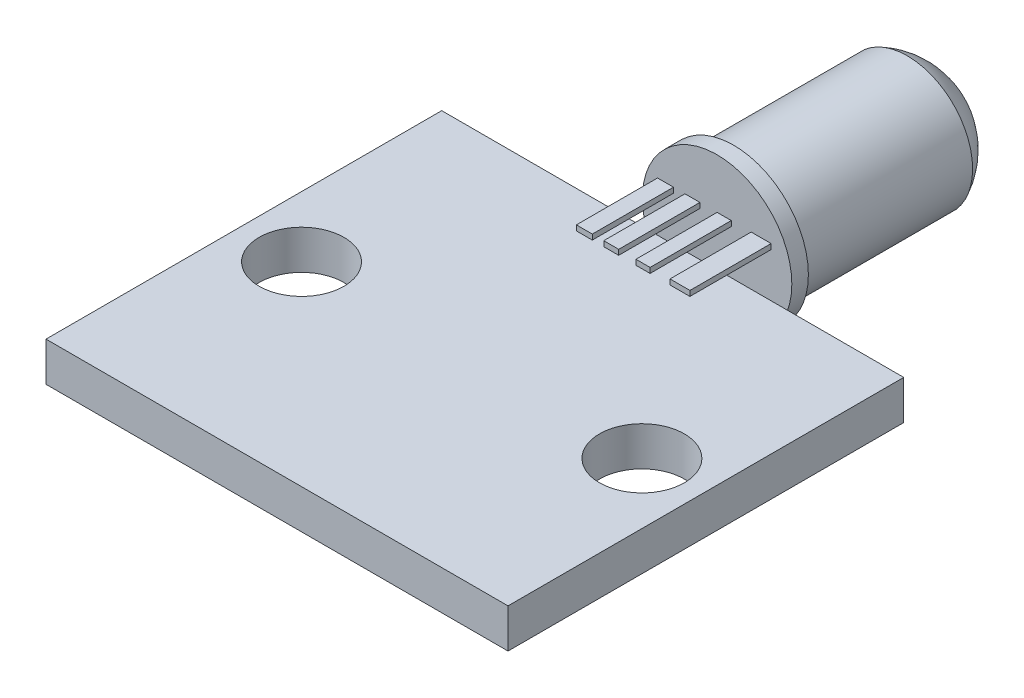
ISO-10303-21;
HEADER;
FILE_DESCRIPTION(('STEP AP214'),'2;1');
FILE_NAME('part.step','',(''),(''),'','','');
FILE_SCHEMA(('AUTOMOTIVE_DESIGN { 1 0 10303 214 1 1 1 1 }'));
ENDSEC;
DATA;
#1=APPLICATION_CONTEXT('core data for automotive mechanical design processes');
#2=APPLICATION_PROTOCOL_DEFINITION('international standard','automotive_design',2000,#1);
#3=PRODUCT_CONTEXT('',#1,'mechanical');
#4=PRODUCT('Part','Part','',(#3));
#5=PRODUCT_RELATED_PRODUCT_CATEGORY('part','',(#4));
#6=PRODUCT_DEFINITION_FORMATION('','',#4);
#7=PRODUCT_DEFINITION_CONTEXT('part definition',#1,'design');
#8=PRODUCT_DEFINITION('design','',#6,#7);
#9=PRODUCT_DEFINITION_SHAPE('','',#8);
#10=(LENGTH_UNIT() NAMED_UNIT(*) SI_UNIT(.MILLI.,.METRE.));
#11=(NAMED_UNIT(*) PLANE_ANGLE_UNIT() SI_UNIT($,.RADIAN.));
#12=(NAMED_UNIT(*) SI_UNIT($,.STERADIAN.) SOLID_ANGLE_UNIT());
#13=UNCERTAINTY_MEASURE_WITH_UNIT(LENGTH_MEASURE(1.E-05),#10,'distance_accuracy_value','');
#14=(GEOMETRIC_REPRESENTATION_CONTEXT(3) GLOBAL_UNCERTAINTY_ASSIGNED_CONTEXT((#13)) GLOBAL_UNIT_ASSIGNED_CONTEXT((#10,
#11,#12)) REPRESENTATION_CONTEXT('',''));
#15=CARTESIAN_POINT('',(0.,0.,0.));
#16=DIRECTION('',(0.,0.,1.));
#17=DIRECTION('',(1.,0.,0.));
#18=AXIS2_PLACEMENT_3D('',#15,#16,#17);
#19=CARTESIAN_POINT('',(0.,0.75,0.));
#20=DIRECTION('',(0.,-1.,0.));
#21=DIRECTION('',(0.,0.,-1.));
#22=AXIS2_PLACEMENT_3D('',#19,#20,#21);
#23=PLANE('',#22);
#24=CARTESIAN_POINT('',(-6.52,0.75,0.120000000000001));
#25=DIRECTION('',(0.,1.,0.));
#26=DIRECTION('',(0.,0.,1.));
#27=AXIS2_PLACEMENT_3D('',#24,#25,#26);
#28=CIRCLE('',#27,1.625);
#29=CARTESIAN_POINT('',(-6.52,0.75,1.745));
#30=VERTEX_POINT('',#29);
#31=EDGE_CURVE('E355',#30,#30,#28,.T.);
#32=ORIENTED_EDGE('',*,*,#31,.F.);
#33=EDGE_LOOP('',(#32));
#34=FACE_BOUND('',#33,.T.);
#35=CARTESIAN_POINT('',(6.52,0.75,0.120000000000001));
#36=DIRECTION('',(0.,1.,0.));
#37=DIRECTION('',(0.,0.,1.));
#38=AXIS2_PLACEMENT_3D('',#35,#36,#37);
#39=CIRCLE('',#38,1.625);
#40=CARTESIAN_POINT('',(6.52,0.75,1.745));
#41=VERTEX_POINT('',#40);
#42=EDGE_CURVE('E349',#41,#41,#39,.T.);
#43=ORIENTED_EDGE('',*,*,#42,.F.);
#44=EDGE_LOOP('',(#43));
#45=FACE_BOUND('',#44,.T.);
#46=DIRECTION('',(0.,0.,1.));
#47=VECTOR('',#46,1.);
#48=CARTESIAN_POINT('',(1.30594712778117,0.75,-9.28));
#49=LINE('',#48,#47);
#50=CARTESIAN_POINT('',(1.30594712778117,0.75,-7.58));
#51=VERTEX_POINT('',#50);
#52=CARTESIAN_POINT('',(1.30594712778117,0.75,-6.16953824510332));
#53=VERTEX_POINT('',#52);
#54=EDGE_CURVE('E219',#51,#53,#49,.T.);
#55=ORIENTED_EDGE('',*,*,#54,.F.);
#56=DIRECTION('',(-1.,0.,0.));
#57=VECTOR('',#56,1.);
#58=CARTESIAN_POINT('',(8.85,0.75,-7.58));
#59=LINE('',#58,#57);
#60=CARTESIAN_POINT('',(0.542718383648274,0.75,-7.58));
#61=VERTEX_POINT('',#60);
#62=EDGE_CURVE('E373',#51,#61,#59,.T.);
#63=ORIENTED_EDGE('',*,*,#62,.T.);
#64=DIRECTION('',(0.,0.,-1.));
#65=VECTOR('',#64,1.);
#66=CARTESIAN_POINT('',(0.542718383648274,0.75,-9.28));
#67=LINE('',#66,#65);
#68=CARTESIAN_POINT('',(0.542718383648274,0.75,-6.16953824510332));
#69=VERTEX_POINT('',#68);
#70=EDGE_CURVE('E249',#69,#61,#67,.T.);
#71=ORIENTED_EDGE('',*,*,#70,.F.);
#72=DIRECTION('',(1.,0.,0.));
#73=VECTOR('',#72,1.);
#74=CARTESIAN_POINT('',(0.,0.75,-6.16953824510332));
#75=LINE('',#74,#73);
#76=CARTESIAN_POINT('',(0.,0.75,-6.16953824510332));
#77=VERTEX_POINT('',#76);
#78=EDGE_CURVE('E245',#77,#69,#75,.T.);
#79=ORIENTED_EDGE('',*,*,#78,.F.);
#80=DIRECTION('',(0.,0.,1.));
#81=VECTOR('',#80,1.);
#82=CARTESIAN_POINT('',(0.,0.75,-9.28));
#83=LINE('',#82,#81);
#84=CARTESIAN_POINT('',(0.,0.75,-7.58));
#85=VERTEX_POINT('',#84);
#86=EDGE_CURVE('E223',#85,#77,#83,.T.);
#87=ORIENTED_EDGE('',*,*,#86,.F.);
#88=CARTESIAN_POINT('',(-0.659366888361046,0.75,-7.58));
#89=VERTEX_POINT('',#88);
#90=EDGE_CURVE('E464',#85,#89,#59,.T.);
#91=ORIENTED_EDGE('',*,*,#90,.T.);
#92=DIRECTION('',(0.,0.,-1.));
#93=VECTOR('',#92,1.);
#94=CARTESIAN_POINT('',(-0.659366888361046,0.75,-9.28));
#95=LINE('',#94,#93);
#96=CARTESIAN_POINT('',(-0.659366888361046,0.75,-6.16953824510332));
#97=VERTEX_POINT('',#96);
#98=EDGE_CURVE('E287',#97,#89,#95,.T.);
#99=ORIENTED_EDGE('',*,*,#98,.F.);
#100=DIRECTION('',(1.,0.,0.));
#101=VECTOR('',#100,1.);
#102=CARTESIAN_POINT('',(-1.23178844646072,0.75,-6.16953824510332));
#103=LINE('',#102,#101);
#104=CARTESIAN_POINT('',(-1.23178844646072,0.75,-6.16953824510332));
#105=VERTEX_POINT('',#104);
#106=EDGE_CURVE('E283',#105,#97,#103,.T.);
#107=ORIENTED_EDGE('',*,*,#106,.F.);
#108=DIRECTION('',(0.,0.,1.));
#109=VECTOR('',#108,1.);
#110=CARTESIAN_POINT('',(-1.23178844646072,0.75,-9.28));
#111=LINE('',#110,#109);
#112=CARTESIAN_POINT('',(-1.23178844646072,0.75,-7.58));
#113=VERTEX_POINT('',#112);
#114=EDGE_CURVE('E266',#113,#105,#111,.T.);
#115=ORIENTED_EDGE('',*,*,#114,.F.);
#116=CARTESIAN_POINT('',(-1.67064497433714,0.75,-7.58));
#117=VERTEX_POINT('',#116);
#118=EDGE_CURVE('E461',#113,#117,#59,.T.);
#119=ORIENTED_EDGE('',*,*,#118,.T.);
#120=DIRECTION('',(0.,0.,-1.));
#121=VECTOR('',#120,1.);
#122=CARTESIAN_POINT('',(-1.67064497433714,0.75,-9.28));
#123=LINE('',#122,#121);
#124=CARTESIAN_POINT('',(-1.67064497433714,0.75,-6.16953824510332));
#125=VERTEX_POINT('',#124);
#126=EDGE_CURVE('E334',#125,#117,#123,.T.);
#127=ORIENTED_EDGE('',*,*,#126,.F.);
#128=DIRECTION('',(1.,0.,0.));
#129=VECTOR('',#128,1.);
#130=CARTESIAN_POINT('',(-2.28122796964346,0.75,-6.16953824510332));
#131=LINE('',#130,#129);
#132=CARTESIAN_POINT('',(-2.28122796964346,0.75,-6.16953824510332));
#133=VERTEX_POINT('',#132);
#134=EDGE_CURVE('E330',#133,#125,#131,.T.);
#135=ORIENTED_EDGE('',*,*,#134,.F.);
#136=DIRECTION('',(0.,0.,1.));
#137=VECTOR('',#136,1.);
#138=CARTESIAN_POINT('',(-2.28122796964346,0.75,-9.28));
#139=LINE('',#138,#137);
#140=CARTESIAN_POINT('',(-2.28122796964346,0.75,-7.58));
#141=VERTEX_POINT('',#140);
#142=EDGE_CURVE('E11',#141,#133,#139,.T.);
#143=ORIENTED_EDGE('',*,*,#142,.F.);
#144=CARTESIAN_POINT('',(-8.85,0.75,-7.58));
#145=VERTEX_POINT('',#144);
#146=EDGE_CURVE('E369',#141,#145,#59,.T.);
#147=ORIENTED_EDGE('',*,*,#146,.T.);
#148=DIRECTION('',(0.,0.,1.));
#149=VECTOR('',#148,1.);
#150=CARTESIAN_POINT('',(-8.85,0.75,-7.58));
#151=LINE('',#150,#149);
#152=CARTESIAN_POINT('',(-8.85,0.75,7.58));
#153=VERTEX_POINT('',#152);
#154=EDGE_CURVE('E361',#145,#153,#151,.T.);
#155=ORIENTED_EDGE('',*,*,#154,.T.);
#156=DIRECTION('',(1.,0.,0.));
#157=VECTOR('',#156,1.);
#158=CARTESIAN_POINT('',(8.85,0.75,7.58));
#159=LINE('',#158,#157);
#160=CARTESIAN_POINT('',(8.85,0.75,7.58));
#161=VERTEX_POINT('',#160);
#162=EDGE_CURVE('E364',#153,#161,#159,.T.);
#163=ORIENTED_EDGE('',*,*,#162,.T.);
#164=DIRECTION('',(0.,0.,-1.));
#165=VECTOR('',#164,1.);
#166=CARTESIAN_POINT('',(8.85,0.75,-7.58));
#167=LINE('',#166,#165);
#168=CARTESIAN_POINT('',(8.85,0.75,-7.58));
#169=VERTEX_POINT('',#168);
#170=EDGE_CURVE('E367',#161,#169,#167,.T.);
#171=ORIENTED_EDGE('',*,*,#170,.T.);
#172=CARTESIAN_POINT('',(2.06917587191407,0.75,-7.58));
#173=VERTEX_POINT('',#172);
#174=EDGE_CURVE('E370',#169,#173,#59,.T.);
#175=ORIENTED_EDGE('',*,*,#174,.T.);
#176=DIRECTION('',(0.,0.,-1.));
#177=VECTOR('',#176,1.);
#178=CARTESIAN_POINT('',(2.06917587191407,0.75,-9.28));
#179=LINE('',#178,#177);
#180=CARTESIAN_POINT('',(2.06917587191407,0.75,-6.16953824510332));
#181=VERTEX_POINT('',#180);
#182=EDGE_CURVE('E55',#181,#173,#179,.T.);
#183=ORIENTED_EDGE('',*,*,#182,.F.);
#184=DIRECTION('',(1.,0.,0.));
#185=VECTOR('',#184,1.);
#186=CARTESIAN_POINT('',(1.30594712778117,0.75,-6.16953824510332));
#187=LINE('',#186,#185);
#188=EDGE_CURVE('E50',#53,#181,#187,.T.);
#189=ORIENTED_EDGE('',*,*,#188,.F.);
#190=EDGE_LOOP('',(#55,#63,#71,#79,#87,#91,#99,#107,#115,#119,#127,#135,#143,#147,#155,#163,
#171,#175,#183,#189));
#191=FACE_BOUND('',#190,.T.);
#192=ADVANCED_FACE('F33',(#34,#45,#191),#23,.F.);
#193=CARTESIAN_POINT('',(0.,-0.75,0.));
#194=DIRECTION('',(0.,-1.,0.));
#195=DIRECTION('',(0.,0.,-1.));
#196=AXIS2_PLACEMENT_3D('',#193,#194,#195);
#197=PLANE('',#196);
#198=CARTESIAN_POINT('',(-6.52,-0.75,0.120000000000001));
#199=DIRECTION('',(0.,1.,0.));
#200=DIRECTION('',(0.,0.,1.));
#201=AXIS2_PLACEMENT_3D('',#198,#199,#200);
#202=CIRCLE('',#201,1.625);
#203=CARTESIAN_POINT('',(-6.52,-0.75,1.745));
#204=VERTEX_POINT('',#203);
#205=EDGE_CURVE('E352',#204,#204,#202,.T.);
#206=ORIENTED_EDGE('',*,*,#205,.T.);
#207=EDGE_LOOP('',(#206));
#208=FACE_BOUND('',#207,.T.);
#209=DIRECTION('',(0.,0.,1.));
#210=VECTOR('',#209,1.);
#211=CARTESIAN_POINT('',(-8.85,-0.75,-7.58));
#212=LINE('',#211,#210);
#213=CARTESIAN_POINT('',(-8.85,-0.75,-7.58));
#214=VERTEX_POINT('',#213);
#215=CARTESIAN_POINT('',(-8.85,-0.75,7.58));
#216=VERTEX_POINT('',#215);
#217=EDGE_CURVE('E358',#214,#216,#212,.T.);
#218=ORIENTED_EDGE('',*,*,#217,.F.);
#219=DIRECTION('',(-1.,0.,0.));
#220=VECTOR('',#219,1.);
#221=CARTESIAN_POINT('',(8.85,-0.75,-7.58));
#222=LINE('',#221,#220);
#223=CARTESIAN_POINT('',(8.85,-0.75,-7.58));
#224=VERTEX_POINT('',#223);
#225=EDGE_CURVE('E365',#224,#214,#222,.T.);
#226=ORIENTED_EDGE('',*,*,#225,.F.);
#227=DIRECTION('',(0.,0.,-1.));
#228=VECTOR('',#227,1.);
#229=CARTESIAN_POINT('',(8.85,-0.75,-7.58));
#230=LINE('',#229,#228);
#231=CARTESIAN_POINT('',(8.85,-0.75,7.58));
#232=VERTEX_POINT('',#231);
#233=EDGE_CURVE('E379',#232,#224,#230,.T.);
#234=ORIENTED_EDGE('',*,*,#233,.F.);
#235=DIRECTION('',(1.,0.,0.));
#236=VECTOR('',#235,1.);
#237=CARTESIAN_POINT('',(8.85,-0.75,7.58));
#238=LINE('',#237,#236);
#239=EDGE_CURVE('E377',#216,#232,#238,.T.);
#240=ORIENTED_EDGE('',*,*,#239,.F.);
#241=EDGE_LOOP('',(#218,#226,#234,#240));
#242=FACE_BOUND('',#241,.T.);
#243=CARTESIAN_POINT('',(6.52,-0.75,0.120000000000001));
#244=DIRECTION('',(0.,1.,0.));
#245=DIRECTION('',(0.,0.,1.));
#246=AXIS2_PLACEMENT_3D('',#243,#244,#245);
#247=CIRCLE('',#246,1.625);
#248=CARTESIAN_POINT('',(6.52,-0.75,1.745));
#249=VERTEX_POINT('',#248);
#250=EDGE_CURVE('E348',#249,#249,#247,.T.);
#251=ORIENTED_EDGE('',*,*,#250,.T.);
#252=EDGE_LOOP('',(#251));
#253=FACE_BOUND('',#252,.T.);
#254=ADVANCED_FACE('F402',(#208,#242,#253),#197,.T.);
#255=CARTESIAN_POINT('',(-8.85,0.75,-7.58));
#256=DIRECTION('',(1.,0.,0.));
#257=DIRECTION('',(0.,0.,-1.));
#258=AXIS2_PLACEMENT_3D('',#255,#256,#257);
#259=PLANE('',#258);
#260=ORIENTED_EDGE('',*,*,#217,.T.);
#261=DIRECTION('',(0.,-1.,0.));
#262=VECTOR('',#261,1.);
#263=CARTESIAN_POINT('',(-8.85,0.75,7.58));
#264=LINE('',#263,#262);
#265=EDGE_CURVE('E37',#153,#216,#264,.T.);
#266=ORIENTED_EDGE('',*,*,#265,.F.);
#267=ORIENTED_EDGE('',*,*,#154,.F.);
#268=DIRECTION('',(0.,-1.,0.));
#269=VECTOR('',#268,1.);
#270=CARTESIAN_POINT('',(-8.85,0.75,-7.58));
#271=LINE('',#270,#269);
#272=EDGE_CURVE('E372',#145,#214,#271,.T.);
#273=ORIENTED_EDGE('',*,*,#272,.T.);
#274=EDGE_LOOP('',(#260,#266,#267,#273));
#275=FACE_BOUND('',#274,.T.);
#276=ADVANCED_FACE('F35',(#275),#259,.F.);
#277=CARTESIAN_POINT('',(8.85,0.75,7.58));
#278=DIRECTION('',(0.,0.,-1.));
#279=DIRECTION('',(-1.,0.,0.));
#280=AXIS2_PLACEMENT_3D('',#277,#278,#279);
#281=PLANE('',#280);
#282=ORIENTED_EDGE('',*,*,#239,.T.);
#283=DIRECTION('',(0.,-1.,0.));
#284=VECTOR('',#283,1.);
#285=CARTESIAN_POINT('',(8.85,0.75,7.58));
#286=LINE('',#285,#284);
#287=EDGE_CURVE('E386',#161,#232,#286,.T.);
#288=ORIENTED_EDGE('',*,*,#287,.F.);
#289=ORIENTED_EDGE('',*,*,#162,.F.);
#290=ORIENTED_EDGE('',*,*,#265,.T.);
#291=EDGE_LOOP('',(#282,#288,#289,#290));
#292=FACE_BOUND('',#291,.T.);
#293=ADVANCED_FACE('F395',(#292),#281,.F.);
#294=CARTESIAN_POINT('',(8.85,0.75,-7.58));
#295=DIRECTION('',(-1.,0.,0.));
#296=DIRECTION('',(0.,0.,1.));
#297=AXIS2_PLACEMENT_3D('',#294,#295,#296);
#298=PLANE('',#297);
#299=ORIENTED_EDGE('',*,*,#233,.T.);
#300=DIRECTION('',(0.,-1.,0.));
#301=VECTOR('',#300,1.);
#302=CARTESIAN_POINT('',(8.85,0.75,-7.58));
#303=LINE('',#302,#301);
#304=EDGE_CURVE('E384',#169,#224,#303,.T.);
#305=ORIENTED_EDGE('',*,*,#304,.F.);
#306=ORIENTED_EDGE('',*,*,#170,.F.);
#307=ORIENTED_EDGE('',*,*,#287,.T.);
#308=EDGE_LOOP('',(#299,#305,#306,#307));
#309=FACE_BOUND('',#308,.T.);
#310=ADVANCED_FACE('F405',(#309),#298,.F.);
#311=CARTESIAN_POINT('',(8.85,0.75,-7.58));
#312=DIRECTION('',(0.,0.,1.));
#313=DIRECTION('',(1.,0.,0.));
#314=AXIS2_PLACEMENT_3D('',#311,#312,#313);
#315=PLANE('',#314);
#316=ORIENTED_EDGE('',*,*,#225,.T.);
#317=ORIENTED_EDGE('',*,*,#272,.F.);
#318=ORIENTED_EDGE('',*,*,#146,.F.);
#319=EDGE_CURVE('E374',#117,#141,#59,.T.);
#320=ORIENTED_EDGE('',*,*,#319,.F.);
#321=ORIENTED_EDGE('',*,*,#118,.F.);
#322=DIRECTION('',(-1.,0.,0.));
#323=VECTOR('',#322,1.);
#324=CARTESIAN_POINT('',(8.85,0.75,-7.58));
#325=LINE('',#324,#323);
#326=EDGE_CURVE('E301',#89,#113,#325,.T.);
#327=ORIENTED_EDGE('',*,*,#326,.F.);
#328=ORIENTED_EDGE('',*,*,#90,.F.);
#329=DIRECTION('',(-1.,0.,0.));
#330=VECTOR('',#329,1.);
#331=CARTESIAN_POINT('',(8.85,0.75,-7.58));
#332=LINE('',#331,#330);
#333=EDGE_CURVE('E263',#61,#85,#332,.T.);
#334=ORIENTED_EDGE('',*,*,#333,.F.);
#335=ORIENTED_EDGE('',*,*,#62,.F.);
#336=DIRECTION('',(-1.,0.,0.));
#337=VECTOR('',#336,1.);
#338=CARTESIAN_POINT('',(8.85,0.75,-7.58));
#339=LINE('',#338,#337);
#340=EDGE_CURVE('E220',#173,#51,#339,.T.);
#341=ORIENTED_EDGE('',*,*,#340,.F.);
#342=ORIENTED_EDGE('',*,*,#174,.F.);
#343=ORIENTED_EDGE('',*,*,#304,.T.);
#344=EDGE_LOOP('',(#316,#317,#318,#320,#321,#327,#328,#334,#335,#341,#342,#343));
#345=FACE_BOUND('',#344,.T.);
#346=ADVANCED_FACE('F408',(#345),#315,.F.);
#347=CARTESIAN_POINT('',(-6.52,0.75,0.120000000000001));
#348=DIRECTION('',(0.,-1.,0.));
#349=DIRECTION('',(0.,0.,-1.));
#350=AXIS2_PLACEMENT_3D('',#347,#348,#349);
#351=CYLINDRICAL_SURFACE('',#350,1.625);
#352=ORIENTED_EDGE('',*,*,#31,.T.);
#353=EDGE_LOOP('',(#352));
#354=FACE_BOUND('',#353,.T.);
#355=ORIENTED_EDGE('',*,*,#205,.F.);
#356=EDGE_LOOP('',(#355));
#357=FACE_BOUND('',#356,.T.);
#358=ADVANCED_FACE('F508',(#354,#357),#351,.F.);
#359=CARTESIAN_POINT('',(6.52,0.75,0.120000000000001));
#360=DIRECTION('',(0.,-1.,0.));
#361=DIRECTION('',(0.,0.,-1.));
#362=AXIS2_PLACEMENT_3D('',#359,#360,#361);
#363=CYLINDRICAL_SURFACE('',#362,1.625);
#364=ORIENTED_EDGE('',*,*,#42,.T.);
#365=EDGE_LOOP('',(#364));
#366=FACE_BOUND('',#365,.T.);
#367=ORIENTED_EDGE('',*,*,#250,.F.);
#368=EDGE_LOOP('',(#367));
#369=FACE_BOUND('',#368,.T.);
#370=ADVANCED_FACE('F551',(#366,#369),#363,.F.);
#371=CARTESIAN_POINT('',(0.,0.75,0.));
#372=DIRECTION('',(0.,1.,0.));
#373=DIRECTION('',(0.,0.,1.));
#374=AXIS2_PLACEMENT_3D('',#371,#372,#373);
#375=PLANE('',#374);
#376=CARTESIAN_POINT('',(-1.67064497433714,0.75,-9.28));
#377=VERTEX_POINT('',#376);
#378=EDGE_CURVE('E333',#117,#377,#123,.T.);
#379=ORIENTED_EDGE('',*,*,#378,.F.);
#380=ORIENTED_EDGE('',*,*,#319,.T.);
#381=CARTESIAN_POINT('',(-2.28122796964346,0.75,-9.28));
#382=VERTEX_POINT('',#381);
#383=EDGE_CURVE('E43',#382,#141,#139,.T.);
#384=ORIENTED_EDGE('',*,*,#383,.F.);
#385=DIRECTION('',(-1.,0.,0.));
#386=VECTOR('',#385,1.);
#387=CARTESIAN_POINT('',(-2.28122796964346,0.75,-9.28));
#388=LINE('',#387,#386);
#389=EDGE_CURVE('E320',#377,#382,#388,.T.);
#390=ORIENTED_EDGE('',*,*,#389,.F.);
#391=EDGE_LOOP('',(#379,#380,#384,#390));
#392=FACE_BOUND('',#391,.T.);
#393=ADVANCED_FACE('F449',(#392),#375,.F.);
#394=CARTESIAN_POINT('',(-2.28122796964346,0.95,-9.28));
#395=DIRECTION('',(1.,0.,0.));
#396=DIRECTION('',(0.,0.,-1.));
#397=AXIS2_PLACEMENT_3D('',#394,#395,#396);
#398=PLANE('',#397);
#399=ORIENTED_EDGE('',*,*,#383,.T.);
#400=ORIENTED_EDGE('',*,*,#142,.T.);
#401=DIRECTION('',(0.,-1.,0.));
#402=VECTOR('',#401,1.);
#403=CARTESIAN_POINT('',(-2.28122796964346,0.95,-6.16953824510332));
#404=LINE('',#403,#402);
#405=CARTESIAN_POINT('',(-2.28122796964346,0.95,-6.16953824510332));
#406=VERTEX_POINT('',#405);
#407=EDGE_CURVE('E345',#406,#133,#404,.T.);
#408=ORIENTED_EDGE('',*,*,#407,.F.);
#409=DIRECTION('',(0.,0.,1.));
#410=VECTOR('',#409,1.);
#411=CARTESIAN_POINT('',(-2.28122796964346,0.95,-9.28));
#412=LINE('',#411,#410);
#413=CARTESIAN_POINT('',(-2.28122796964346,0.95,-9.28));
#414=VERTEX_POINT('',#413);
#415=EDGE_CURVE('E316',#414,#406,#412,.T.);
#416=ORIENTED_EDGE('',*,*,#415,.F.);
#417=DIRECTION('',(0.,-1.,0.));
#418=VECTOR('',#417,1.);
#419=CARTESIAN_POINT('',(-2.28122796964346,0.95,-9.28));
#420=LINE('',#419,#418);
#421=EDGE_CURVE('E327',#414,#382,#420,.T.);
#422=ORIENTED_EDGE('',*,*,#421,.T.);
#423=EDGE_LOOP('',(#399,#400,#408,#416,#422));
#424=FACE_BOUND('',#423,.T.);
#425=ADVANCED_FACE('F452',(#424),#398,.F.);
#426=CARTESIAN_POINT('',(-2.28122796964346,0.95,-6.16953824510332));
#427=DIRECTION('',(0.,0.,-1.));
#428=DIRECTION('',(-1.,0.,0.));
#429=AXIS2_PLACEMENT_3D('',#426,#427,#428);
#430=PLANE('',#429);
#431=ORIENTED_EDGE('',*,*,#134,.T.);
#432=DIRECTION('',(0.,-1.,0.));
#433=VECTOR('',#432,1.);
#434=CARTESIAN_POINT('',(-1.67064497433714,0.95,-6.16953824510332));
#435=LINE('',#434,#433);
#436=CARTESIAN_POINT('',(-1.67064497433714,0.95,-6.16953824510332));
#437=VERTEX_POINT('',#436);
#438=EDGE_CURVE('E342',#437,#125,#435,.T.);
#439=ORIENTED_EDGE('',*,*,#438,.F.);
#440=DIRECTION('',(1.,0.,0.));
#441=VECTOR('',#440,1.);
#442=CARTESIAN_POINT('',(-2.28122796964346,0.95,-6.16953824510332));
#443=LINE('',#442,#441);
#444=EDGE_CURVE('E319',#406,#437,#443,.T.);
#445=ORIENTED_EDGE('',*,*,#444,.F.);
#446=ORIENTED_EDGE('',*,*,#407,.T.);
#447=EDGE_LOOP('',(#431,#439,#445,#446));
#448=FACE_BOUND('',#447,.T.);
#449=ADVANCED_FACE('F458',(#448),#430,.F.);
#450=CARTESIAN_POINT('',(-1.67064497433714,0.95,-9.28));
#451=DIRECTION('',(-1.,0.,0.));
#452=DIRECTION('',(0.,0.,1.));
#453=AXIS2_PLACEMENT_3D('',#450,#451,#452);
#454=PLANE('',#453);
#455=ORIENTED_EDGE('',*,*,#126,.T.);
#456=ORIENTED_EDGE('',*,*,#378,.T.);
#457=DIRECTION('',(0.,-1.,0.));
#458=VECTOR('',#457,1.);
#459=CARTESIAN_POINT('',(-1.67064497433714,0.95,-9.28));
#460=LINE('',#459,#458);
#461=CARTESIAN_POINT('',(-1.67064497433714,0.95,-9.28));
#462=VERTEX_POINT('',#461);
#463=EDGE_CURVE('E340',#462,#377,#460,.T.);
#464=ORIENTED_EDGE('',*,*,#463,.F.);
#465=DIRECTION('',(0.,0.,-1.));
#466=VECTOR('',#465,1.);
#467=CARTESIAN_POINT('',(-1.67064497433714,0.95,-9.28));
#468=LINE('',#467,#466);
#469=EDGE_CURVE('E322',#437,#462,#468,.T.);
#470=ORIENTED_EDGE('',*,*,#469,.F.);
#471=ORIENTED_EDGE('',*,*,#438,.T.);
#472=EDGE_LOOP('',(#455,#456,#464,#470,#471));
#473=FACE_BOUND('',#472,.T.);
#474=ADVANCED_FACE('F445',(#473),#454,.F.);
#475=CARTESIAN_POINT('',(0.,0.95,0.));
#476=DIRECTION('',(0.,1.,0.));
#477=DIRECTION('',(0.,0.,1.));
#478=AXIS2_PLACEMENT_3D('',#475,#476,#477);
#479=PLANE('',#478);
#480=ORIENTED_EDGE('',*,*,#415,.T.);
#481=ORIENTED_EDGE('',*,*,#444,.T.);
#482=ORIENTED_EDGE('',*,*,#469,.T.);
#483=DIRECTION('',(-1.,0.,0.));
#484=VECTOR('',#483,1.);
#485=CARTESIAN_POINT('',(-2.28122796964346,0.95,-9.28));
#486=LINE('',#485,#484);
#487=EDGE_CURVE('E325',#462,#414,#486,.T.);
#488=ORIENTED_EDGE('',*,*,#487,.T.);
#489=EDGE_LOOP('',(#480,#481,#482,#488));
#490=FACE_BOUND('',#489,.T.);
#491=ADVANCED_FACE('F433',(#490),#479,.T.);
#492=CARTESIAN_POINT('',(-2.86249958736952,0.,-9.28));
#493=DIRECTION('',(0.,0.,-1.));
#494=DIRECTION('',(-1.,0.,0.));
#495=AXIS2_PLACEMENT_3D('',#492,#493,#494);
#496=PLANE('',#495);
#497=DIRECTION('',(0.,-1.,0.));
#498=VECTOR('',#497,1.);
#499=CARTESIAN_POINT('',(1.30594712778117,0.95,-9.28));
#500=LINE('',#499,#498);
#501=CARTESIAN_POINT('',(1.30594712778117,0.95,-9.28));
#502=VERTEX_POINT('',#501);
#503=CARTESIAN_POINT('',(1.30594712778117,0.75,-9.28));
#504=VERTEX_POINT('',#503);
#505=EDGE_CURVE('E424',#502,#504,#500,.T.);
#506=ORIENTED_EDGE('',*,*,#505,.F.);
#507=DIRECTION('',(-1.,0.,0.));
#508=VECTOR('',#507,1.);
#509=CARTESIAN_POINT('',(1.30594712778117,0.95,-9.28));
#510=LINE('',#509,#508);
#511=CARTESIAN_POINT('',(2.06917587191407,0.95,-9.28));
#512=VERTEX_POINT('',#511);
#513=EDGE_CURVE('E212',#512,#502,#510,.T.);
#514=ORIENTED_EDGE('',*,*,#513,.F.);
#515=DIRECTION('',(0.,-1.,0.));
#516=VECTOR('',#515,1.);
#517=CARTESIAN_POINT('',(2.06917587191407,0.95,-9.28));
#518=LINE('',#517,#516);
#519=CARTESIAN_POINT('',(2.06917587191407,0.75,-9.28));
#520=VERTEX_POINT('',#519);
#521=EDGE_CURVE('E225',#512,#520,#518,.T.);
#522=ORIENTED_EDGE('',*,*,#521,.T.);
#523=DIRECTION('',(-1.,0.,0.));
#524=VECTOR('',#523,1.);
#525=CARTESIAN_POINT('',(1.30594712778117,0.75,-9.28));
#526=LINE('',#525,#524);
#527=EDGE_CURVE('E215',#520,#504,#526,.T.);
#528=ORIENTED_EDGE('',*,*,#527,.T.);
#529=EDGE_LOOP('',(#506,#514,#522,#528));
#530=FACE_BOUND('',#529,.T.);
#531=DIRECTION('',(0.,-1.,0.));
#532=VECTOR('',#531,1.);
#533=CARTESIAN_POINT('',(0.,0.95,-9.28));
#534=LINE('',#533,#532);
#535=CARTESIAN_POINT('',(0.,0.95,-9.28));
#536=VERTEX_POINT('',#535);
#537=CARTESIAN_POINT('',(0.,0.75,-9.28));
#538=VERTEX_POINT('',#537);
#539=EDGE_CURVE('E241',#536,#538,#534,.T.);
#540=ORIENTED_EDGE('',*,*,#539,.F.);
#541=DIRECTION('',(-1.,0.,0.));
#542=VECTOR('',#541,1.);
#543=CARTESIAN_POINT('',(0.,0.95,-9.28));
#544=LINE('',#543,#542);
#545=CARTESIAN_POINT('',(0.542718383648274,0.95,-9.28));
#546=VERTEX_POINT('',#545);
#547=EDGE_CURVE('E238',#546,#536,#544,.T.);
#548=ORIENTED_EDGE('',*,*,#547,.F.);
#549=DIRECTION('',(0.,-1.,0.));
#550=VECTOR('',#549,1.);
#551=CARTESIAN_POINT('',(0.542718383648274,0.95,-9.28));
#552=LINE('',#551,#550);
#553=CARTESIAN_POINT('',(0.542718383648274,0.75,-9.28));
#554=VERTEX_POINT('',#553);
#555=EDGE_CURVE('E255',#546,#554,#552,.T.);
#556=ORIENTED_EDGE('',*,*,#555,.T.);
#557=DIRECTION('',(-1.,0.,0.));
#558=VECTOR('',#557,1.);
#559=CARTESIAN_POINT('',(0.,0.75,-9.28));
#560=LINE('',#559,#558);
#561=EDGE_CURVE('E233',#554,#538,#560,.T.);
#562=ORIENTED_EDGE('',*,*,#561,.T.);
#563=EDGE_LOOP('',(#540,#548,#556,#562));
#564=FACE_BOUND('',#563,.T.);
#565=DIRECTION('',(0.,-1.,0.));
#566=VECTOR('',#565,1.);
#567=CARTESIAN_POINT('',(-1.23178844646072,0.95,-9.28));
#568=LINE('',#567,#566);
#569=CARTESIAN_POINT('',(-1.23178844646072,0.95,-9.28));
#570=VERTEX_POINT('',#569);
#571=CARTESIAN_POINT('',(-1.23178844646072,0.75,-9.28));
#572=VERTEX_POINT('',#571);
#573=EDGE_CURVE('E279',#570,#572,#568,.T.);
#574=ORIENTED_EDGE('',*,*,#573,.F.);
#575=DIRECTION('',(-1.,0.,0.));
#576=VECTOR('',#575,1.);
#577=CARTESIAN_POINT('',(-1.23178844646072,0.95,-9.28));
#578=LINE('',#577,#576);
#579=CARTESIAN_POINT('',(-0.659366888361046,0.95,-9.28));
#580=VERTEX_POINT('',#579);
#581=EDGE_CURVE('E276',#580,#570,#578,.T.);
#582=ORIENTED_EDGE('',*,*,#581,.F.);
#583=DIRECTION('',(0.,-1.,0.));
#584=VECTOR('',#583,1.);
#585=CARTESIAN_POINT('',(-0.659366888361046,0.95,-9.28));
#586=LINE('',#585,#584);
#587=CARTESIAN_POINT('',(-0.659366888361046,0.75,-9.28));
#588=VERTEX_POINT('',#587);
#589=EDGE_CURVE('E293',#580,#588,#586,.T.);
#590=ORIENTED_EDGE('',*,*,#589,.T.);
#591=DIRECTION('',(-1.,0.,0.));
#592=VECTOR('',#591,1.);
#593=CARTESIAN_POINT('',(-1.23178844646072,0.75,-9.28));
#594=LINE('',#593,#592);
#595=EDGE_CURVE('E271',#588,#572,#594,.T.);
#596=ORIENTED_EDGE('',*,*,#595,.T.);
#597=EDGE_LOOP('',(#574,#582,#590,#596));
#598=FACE_BOUND('',#597,.T.);
#599=CARTESIAN_POINT('',(0.,0.,-9.28));
#600=DIRECTION('',(0.,0.,1.));
#601=DIRECTION('',(1.,0.,0.));
#602=AXIS2_PLACEMENT_3D('',#599,#600,#601);
#603=CIRCLE('',#602,2.86249958736952);
#604=CARTESIAN_POINT('',(2.86249958736952,0.,-9.28));
#605=VERTEX_POINT('',#604);
#606=EDGE_CURVE('E304',#605,#605,#603,.T.);
#607=ORIENTED_EDGE('',*,*,#606,.T.);
#608=EDGE_LOOP('',(#607));
#609=FACE_BOUND('',#608,.T.);
#610=ORIENTED_EDGE('',*,*,#463,.T.);
#611=ORIENTED_EDGE('',*,*,#389,.T.);
#612=ORIENTED_EDGE('',*,*,#421,.F.);
#613=ORIENTED_EDGE('',*,*,#487,.F.);
#614=EDGE_LOOP('',(#610,#611,#612,#613));
#615=FACE_BOUND('',#614,.T.);
#616=ADVANCED_FACE('F426',(#530,#564,#598,#609,#615),#496,.F.);
#617=CARTESIAN_POINT('',(0.,0.,-15.347953826349));
#618=DIRECTION('',(0.,0.,1.));
#619=DIRECTION('',(-1.,0.,0.));
#620=AXIS2_PLACEMENT_3D('',#617,#618,#619);
#621=SPHERICAL_SURFACE('',#620,2.78204617365098);
#622=CARTESIAN_POINT('',(0.,0.,-16.5685298839141));
#623=DIRECTION('',(0.,0.,1.));
#624=DIRECTION('',(1.,0.,0.));
#625=AXIS2_PLACEMENT_3D('',#622,#623,#624);
#626=CIRCLE('',#625,2.499995);
#627=CARTESIAN_POINT('',(2.499995,0.,-16.5685298839141));
#628=VERTEX_POINT('',#627);
#629=EDGE_CURVE('E313',#628,#628,#626,.T.);
#630=ORIENTED_EDGE('',*,*,#629,.F.);
#631=EDGE_LOOP('',(#630));
#632=FACE_BOUND('',#631,.T.);
#633=ADVANCED_FACE('F432',(#632),#621,.T.);
#634=CARTESIAN_POINT('',(0.,0.,0.));
#635=DIRECTION('',(0.,0.,1.));
#636=DIRECTION('',(1.,0.,0.));
#637=AXIS2_PLACEMENT_3D('',#634,#635,#636);
#638=CYLINDRICAL_SURFACE('',#637,2.499995);
#639=CARTESIAN_POINT('',(0.,0.,-9.91463760395989));
#640=DIRECTION('',(0.,0.,1.));
#641=DIRECTION('',(1.,0.,0.));
#642=AXIS2_PLACEMENT_3D('',#639,#640,#641);
#643=CIRCLE('',#642,2.499995);
#644=CARTESIAN_POINT('',(2.499995,0.,-9.91463760395989));
#645=VERTEX_POINT('',#644);
#646=EDGE_CURVE('E310',#645,#645,#643,.T.);
#647=ORIENTED_EDGE('',*,*,#646,.F.);
#648=EDGE_LOOP('',(#647));
#649=FACE_BOUND('',#648,.T.);
#650=ORIENTED_EDGE('',*,*,#629,.T.);
#651=EDGE_LOOP('',(#650));
#652=FACE_BOUND('',#651,.T.);
#653=ADVANCED_FACE('F572',(#649,#652),#638,.T.);
#654=CARTESIAN_POINT('',(-2.499995,0.,-9.91463760395989));
#655=DIRECTION('',(0.,0.,1.));
#656=DIRECTION('',(1.,0.,0.));
#657=AXIS2_PLACEMENT_3D('',#654,#655,#656);
#658=PLANE('',#657);
#659=CARTESIAN_POINT('',(0.,0.,-9.91463760395989));
#660=DIRECTION('',(0.,0.,1.));
#661=DIRECTION('',(1.,0.,0.));
#662=AXIS2_PLACEMENT_3D('',#659,#660,#661);
#663=CIRCLE('',#662,2.86249958736952);
#664=CARTESIAN_POINT('',(2.86249958736952,0.,-9.91463760395989));
#665=VERTEX_POINT('',#664);
#666=EDGE_CURVE('E307',#665,#665,#663,.T.);
#667=ORIENTED_EDGE('',*,*,#666,.F.);
#668=EDGE_LOOP('',(#667));
#669=FACE_BOUND('',#668,.T.);
#670=ORIENTED_EDGE('',*,*,#646,.T.);
#671=EDGE_LOOP('',(#670));
#672=FACE_BOUND('',#671,.T.);
#673=ADVANCED_FACE('F581',(#669,#672),#658,.F.);
#674=CARTESIAN_POINT('',(0.,0.,0.));
#675=DIRECTION('',(0.,0.,1.));
#676=DIRECTION('',(1.,0.,0.));
#677=AXIS2_PLACEMENT_3D('',#674,#675,#676);
#678=CYLINDRICAL_SURFACE('',#677,2.86249958736952);
#679=ORIENTED_EDGE('',*,*,#606,.F.);
#680=EDGE_LOOP('',(#679));
#681=FACE_BOUND('',#680,.T.);
#682=ORIENTED_EDGE('',*,*,#666,.T.);
#683=EDGE_LOOP('',(#682));
#684=FACE_BOUND('',#683,.T.);
#685=ADVANCED_FACE('F590',(#681,#684),#678,.T.);
#686=CARTESIAN_POINT('',(0.,0.75,0.));
#687=DIRECTION('',(0.,1.,0.));
#688=DIRECTION('',(0.,0.,1.));
#689=AXIS2_PLACEMENT_3D('',#686,#687,#688);
#690=PLANE('',#689);
#691=EDGE_CURVE('E286',#89,#588,#95,.T.);
#692=ORIENTED_EDGE('',*,*,#691,.F.);
#693=ORIENTED_EDGE('',*,*,#326,.T.);
#694=EDGE_CURVE('E280',#572,#113,#111,.T.);
#695=ORIENTED_EDGE('',*,*,#694,.F.);
#696=ORIENTED_EDGE('',*,*,#595,.F.);
#697=EDGE_LOOP('',(#692,#693,#695,#696));
#698=FACE_BOUND('',#697,.T.);
#699=ADVANCED_FACE('F599',(#698),#690,.F.);
#700=CARTESIAN_POINT('',(-1.23178844646072,0.95,-9.28));
#701=DIRECTION('',(1.,0.,0.));
#702=DIRECTION('',(0.,0.,-1.));
#703=AXIS2_PLACEMENT_3D('',#700,#701,#702);
#704=PLANE('',#703);
#705=ORIENTED_EDGE('',*,*,#694,.T.);
#706=ORIENTED_EDGE('',*,*,#114,.T.);
#707=DIRECTION('',(0.,-1.,0.));
#708=VECTOR('',#707,1.);
#709=CARTESIAN_POINT('',(-1.23178844646072,0.95,-6.16953824510332));
#710=LINE('',#709,#708);
#711=CARTESIAN_POINT('',(-1.23178844646072,0.95,-6.16953824510332));
#712=VERTEX_POINT('',#711);
#713=EDGE_CURVE('E298',#712,#105,#710,.T.);
#714=ORIENTED_EDGE('',*,*,#713,.F.);
#715=DIRECTION('',(0.,0.,1.));
#716=VECTOR('',#715,1.);
#717=CARTESIAN_POINT('',(-1.23178844646072,0.95,-9.28));
#718=LINE('',#717,#716);
#719=EDGE_CURVE('E267',#570,#712,#718,.T.);
#720=ORIENTED_EDGE('',*,*,#719,.F.);
#721=ORIENTED_EDGE('',*,*,#573,.T.);
#722=EDGE_LOOP('',(#705,#706,#714,#720,#721));
#723=FACE_BOUND('',#722,.T.);
#724=ADVANCED_FACE('F645',(#723),#704,.F.);
#725=CARTESIAN_POINT('',(-1.23178844646072,0.95,-6.16953824510332));
#726=DIRECTION('',(0.,0.,-1.));
#727=DIRECTION('',(-1.,0.,0.));
#728=AXIS2_PLACEMENT_3D('',#725,#726,#727);
#729=PLANE('',#728);
#730=ORIENTED_EDGE('',*,*,#106,.T.);
#731=DIRECTION('',(0.,-1.,0.));
#732=VECTOR('',#731,1.);
#733=CARTESIAN_POINT('',(-0.659366888361046,0.95,-6.16953824510332));
#734=LINE('',#733,#732);
#735=CARTESIAN_POINT('',(-0.659366888361046,0.95,-6.16953824510332));
#736=VERTEX_POINT('',#735);
#737=EDGE_CURVE('E295',#736,#97,#734,.T.);
#738=ORIENTED_EDGE('',*,*,#737,.F.);
#739=DIRECTION('',(1.,0.,0.));
#740=VECTOR('',#739,1.);
#741=CARTESIAN_POINT('',(-1.23178844646072,0.95,-6.16953824510332));
#742=LINE('',#741,#740);
#743=EDGE_CURVE('E270',#712,#736,#742,.T.);
#744=ORIENTED_EDGE('',*,*,#743,.F.);
#745=ORIENTED_EDGE('',*,*,#713,.T.);
#746=EDGE_LOOP('',(#730,#738,#744,#745));
#747=FACE_BOUND('',#746,.T.);
#748=ADVANCED_FACE('F654',(#747),#729,.F.);
#749=CARTESIAN_POINT('',(-0.659366888361046,0.95,-9.28));
#750=DIRECTION('',(-1.,0.,0.));
#751=DIRECTION('',(0.,0.,1.));
#752=AXIS2_PLACEMENT_3D('',#749,#750,#751);
#753=PLANE('',#752);
#754=ORIENTED_EDGE('',*,*,#98,.T.);
#755=ORIENTED_EDGE('',*,*,#691,.T.);
#756=ORIENTED_EDGE('',*,*,#589,.F.);
#757=DIRECTION('',(0.,0.,-1.));
#758=VECTOR('',#757,1.);
#759=CARTESIAN_POINT('',(-0.659366888361046,0.95,-9.28));
#760=LINE('',#759,#758);
#761=EDGE_CURVE('E273',#736,#580,#760,.T.);
#762=ORIENTED_EDGE('',*,*,#761,.F.);
#763=ORIENTED_EDGE('',*,*,#737,.T.);
#764=EDGE_LOOP('',(#754,#755,#756,#762,#763));
#765=FACE_BOUND('',#764,.T.);
#766=ADVANCED_FACE('F663',(#765),#753,.F.);
#767=CARTESIAN_POINT('',(0.,0.95,0.));
#768=DIRECTION('',(0.,1.,0.));
#769=DIRECTION('',(0.,0.,1.));
#770=AXIS2_PLACEMENT_3D('',#767,#768,#769);
#771=PLANE('',#770);
#772=ORIENTED_EDGE('',*,*,#719,.T.);
#773=ORIENTED_EDGE('',*,*,#743,.T.);
#774=ORIENTED_EDGE('',*,*,#761,.T.);
#775=ORIENTED_EDGE('',*,*,#581,.T.);
#776=EDGE_LOOP('',(#772,#773,#774,#775));
#777=FACE_BOUND('',#776,.T.);
#778=ADVANCED_FACE('F672',(#777),#771,.T.);
#779=CARTESIAN_POINT('',(0.,0.75,0.));
#780=DIRECTION('',(0.,1.,0.));
#781=DIRECTION('',(0.,0.,1.));
#782=AXIS2_PLACEMENT_3D('',#779,#780,#781);
#783=PLANE('',#782);
#784=EDGE_CURVE('E248',#61,#554,#67,.T.);
#785=ORIENTED_EDGE('',*,*,#784,.F.);
#786=ORIENTED_EDGE('',*,*,#333,.T.);
#787=EDGE_CURVE('E242',#538,#85,#83,.T.);
#788=ORIENTED_EDGE('',*,*,#787,.F.);
#789=ORIENTED_EDGE('',*,*,#561,.F.);
#790=EDGE_LOOP('',(#785,#786,#788,#789));
#791=FACE_BOUND('',#790,.T.);
#792=ADVANCED_FACE('F472',(#791),#783,.F.);
#793=CARTESIAN_POINT('',(0.,0.95,-9.28));
#794=DIRECTION('',(1.,0.,0.));
#795=DIRECTION('',(0.,0.,-1.));
#796=AXIS2_PLACEMENT_3D('',#793,#794,#795);
#797=PLANE('',#796);
#798=ORIENTED_EDGE('',*,*,#787,.T.);
#799=ORIENTED_EDGE('',*,*,#86,.T.);
#800=DIRECTION('',(0.,-1.,0.));
#801=VECTOR('',#800,1.);
#802=CARTESIAN_POINT('',(0.,0.95,-6.16953824510332));
#803=LINE('',#802,#801);
#804=CARTESIAN_POINT('',(0.,0.95,-6.16953824510332));
#805=VERTEX_POINT('',#804);
#806=EDGE_CURVE('E260',#805,#77,#803,.T.);
#807=ORIENTED_EDGE('',*,*,#806,.F.);
#808=DIRECTION('',(0.,0.,1.));
#809=VECTOR('',#808,1.);
#810=CARTESIAN_POINT('',(0.,0.95,-9.28));
#811=LINE('',#810,#809);
#812=EDGE_CURVE('E229',#536,#805,#811,.T.);
#813=ORIENTED_EDGE('',*,*,#812,.F.);
#814=ORIENTED_EDGE('',*,*,#539,.T.);
#815=EDGE_LOOP('',(#798,#799,#807,#813,#814));
#816=FACE_BOUND('',#815,.T.);
#817=ADVANCED_FACE('F483',(#816),#797,.F.);
#818=CARTESIAN_POINT('',(0.,0.95,-6.16953824510332));
#819=DIRECTION('',(0.,0.,-1.));
#820=DIRECTION('',(-1.,0.,0.));
#821=AXIS2_PLACEMENT_3D('',#818,#819,#820);
#822=PLANE('',#821);
#823=ORIENTED_EDGE('',*,*,#78,.T.);
#824=DIRECTION('',(0.,-1.,0.));
#825=VECTOR('',#824,1.);
#826=CARTESIAN_POINT('',(0.542718383648274,0.95,-6.16953824510332));
#827=LINE('',#826,#825);
#828=CARTESIAN_POINT('',(0.542718383648274,0.95,-6.16953824510332));
#829=VERTEX_POINT('',#828);
#830=EDGE_CURVE('E257',#829,#69,#827,.T.);
#831=ORIENTED_EDGE('',*,*,#830,.F.);
#832=DIRECTION('',(1.,0.,0.));
#833=VECTOR('',#832,1.);
#834=CARTESIAN_POINT('',(0.,0.95,-6.16953824510332));
#835=LINE('',#834,#833);
#836=EDGE_CURVE('E232',#805,#829,#835,.T.);
#837=ORIENTED_EDGE('',*,*,#836,.F.);
#838=ORIENTED_EDGE('',*,*,#806,.T.);
#839=EDGE_LOOP('',(#823,#831,#837,#838));
#840=FACE_BOUND('',#839,.T.);
#841=ADVANCED_FACE('F479',(#840),#822,.F.);
#842=CARTESIAN_POINT('',(0.542718383648274,0.95,-9.28));
#843=DIRECTION('',(-1.,0.,0.));
#844=DIRECTION('',(0.,0.,1.));
#845=AXIS2_PLACEMENT_3D('',#842,#843,#844);
#846=PLANE('',#845);
#847=ORIENTED_EDGE('',*,*,#70,.T.);
#848=ORIENTED_EDGE('',*,*,#784,.T.);
#849=ORIENTED_EDGE('',*,*,#555,.F.);
#850=DIRECTION('',(0.,0.,-1.));
#851=VECTOR('',#850,1.);
#852=CARTESIAN_POINT('',(0.542718383648274,0.95,-9.28));
#853=LINE('',#852,#851);
#854=EDGE_CURVE('E235',#829,#546,#853,.T.);
#855=ORIENTED_EDGE('',*,*,#854,.F.);
#856=ORIENTED_EDGE('',*,*,#830,.T.);
#857=EDGE_LOOP('',(#847,#848,#849,#855,#856));
#858=FACE_BOUND('',#857,.T.);
#859=ADVANCED_FACE('F475',(#858),#846,.F.);
#860=CARTESIAN_POINT('',(0.,0.95,0.));
#861=DIRECTION('',(0.,1.,0.));
#862=DIRECTION('',(0.,0.,1.));
#863=AXIS2_PLACEMENT_3D('',#860,#861,#862);
#864=PLANE('',#863);
#865=ORIENTED_EDGE('',*,*,#812,.T.);
#866=ORIENTED_EDGE('',*,*,#836,.T.);
#867=ORIENTED_EDGE('',*,*,#854,.T.);
#868=ORIENTED_EDGE('',*,*,#547,.T.);
#869=EDGE_LOOP('',(#865,#866,#867,#868));
#870=FACE_BOUND('',#869,.T.);
#871=ADVANCED_FACE('F486',(#870),#864,.T.);
#872=CARTESIAN_POINT('',(0.,0.75,0.));
#873=DIRECTION('',(0.,1.,0.));
#874=DIRECTION('',(0.,0.,1.));
#875=AXIS2_PLACEMENT_3D('',#872,#873,#874);
#876=PLANE('',#875);
#877=EDGE_CURVE('E413',#173,#520,#179,.T.);
#878=ORIENTED_EDGE('',*,*,#877,.F.);
#879=ORIENTED_EDGE('',*,*,#340,.T.);
#880=EDGE_CURVE('E430',#504,#51,#49,.T.);
#881=ORIENTED_EDGE('',*,*,#880,.F.);
#882=ORIENTED_EDGE('',*,*,#527,.F.);
#883=EDGE_LOOP('',(#878,#879,#881,#882));
#884=FACE_BOUND('',#883,.T.);
#885=ADVANCED_FACE('F414',(#884),#876,.F.);
#886=CARTESIAN_POINT('',(1.30594712778117,0.95,-9.28));
#887=DIRECTION('',(1.,0.,0.));
#888=DIRECTION('',(0.,0.,-1.));
#889=AXIS2_PLACEMENT_3D('',#886,#887,#888);
#890=PLANE('',#889);
#891=ORIENTED_EDGE('',*,*,#880,.T.);
#892=ORIENTED_EDGE('',*,*,#54,.T.);
#893=DIRECTION('',(0.,-1.,0.));
#894=VECTOR('',#893,1.);
#895=CARTESIAN_POINT('',(1.30594712778117,0.95,-6.16953824510332));
#896=LINE('',#895,#894);
#897=CARTESIAN_POINT('',(1.30594712778117,0.95,-6.16953824510332));
#898=VERTEX_POINT('',#897);
#899=EDGE_CURVE('E200',#898,#53,#896,.T.);
#900=ORIENTED_EDGE('',*,*,#899,.F.);
#901=DIRECTION('',(0.,0.,1.));
#902=VECTOR('',#901,1.);
#903=CARTESIAN_POINT('',(1.30594712778117,0.95,-9.28));
#904=LINE('',#903,#902);
#905=EDGE_CURVE('E207',#502,#898,#904,.T.);
#906=ORIENTED_EDGE('',*,*,#905,.F.);
#907=ORIENTED_EDGE('',*,*,#505,.T.);
#908=EDGE_LOOP('',(#891,#892,#900,#906,#907));
#909=FACE_BOUND('',#908,.T.);
#910=ADVANCED_FACE('F218',(#909),#890,.F.);
#911=CARTESIAN_POINT('',(1.30594712778117,0.95,-6.16953824510332));
#912=DIRECTION('',(0.,0.,-1.));
#913=DIRECTION('',(-1.,0.,0.));
#914=AXIS2_PLACEMENT_3D('',#911,#912,#913);
#915=PLANE('',#914);
#916=ORIENTED_EDGE('',*,*,#188,.T.);
#917=DIRECTION('',(0.,-1.,0.));
#918=VECTOR('',#917,1.);
#919=CARTESIAN_POINT('',(2.06917587191407,0.95,-6.16953824510332));
#920=LINE('',#919,#918);
#921=CARTESIAN_POINT('',(2.06917587191407,0.95,-6.16953824510332));
#922=VERTEX_POINT('',#921);
#923=EDGE_CURVE('E202',#922,#181,#920,.T.);
#924=ORIENTED_EDGE('',*,*,#923,.F.);
#925=DIRECTION('',(1.,0.,0.));
#926=VECTOR('',#925,1.);
#927=CARTESIAN_POINT('',(1.30594712778117,0.95,-6.16953824510332));
#928=LINE('',#927,#926);
#929=EDGE_CURVE('E196',#898,#922,#928,.T.);
#930=ORIENTED_EDGE('',*,*,#929,.F.);
#931=ORIENTED_EDGE('',*,*,#899,.T.);
#932=EDGE_LOOP('',(#916,#924,#930,#931));
#933=FACE_BOUND('',#932,.T.);
#934=ADVANCED_FACE('F198',(#933),#915,.F.);
#935=CARTESIAN_POINT('',(2.06917587191407,0.95,-9.28));
#936=DIRECTION('',(-1.,0.,0.));
#937=DIRECTION('',(0.,0.,1.));
#938=AXIS2_PLACEMENT_3D('',#935,#936,#937);
#939=PLANE('',#938);
#940=ORIENTED_EDGE('',*,*,#182,.T.);
#941=ORIENTED_EDGE('',*,*,#877,.T.);
#942=ORIENTED_EDGE('',*,*,#521,.F.);
#943=DIRECTION('',(0.,0.,-1.));
#944=VECTOR('',#943,1.);
#945=CARTESIAN_POINT('',(2.06917587191407,0.95,-9.28));
#946=LINE('',#945,#944);
#947=EDGE_CURVE('E206',#922,#512,#946,.T.);
#948=ORIENTED_EDGE('',*,*,#947,.F.);
#949=ORIENTED_EDGE('',*,*,#923,.T.);
#950=EDGE_LOOP('',(#940,#941,#942,#948,#949));
#951=FACE_BOUND('',#950,.T.);
#952=ADVANCED_FACE('F419',(#951),#939,.F.);
#953=CARTESIAN_POINT('',(0.,0.95,0.));
#954=DIRECTION('',(0.,1.,0.));
#955=DIRECTION('',(0.,0.,1.));
#956=AXIS2_PLACEMENT_3D('',#953,#954,#955);
#957=PLANE('',#956);
#958=ORIENTED_EDGE('',*,*,#905,.T.);
#959=ORIENTED_EDGE('',*,*,#929,.T.);
#960=ORIENTED_EDGE('',*,*,#947,.T.);
#961=ORIENTED_EDGE('',*,*,#513,.T.);
#962=EDGE_LOOP('',(#958,#959,#960,#961));
#963=FACE_BOUND('',#962,.T.);
#964=ADVANCED_FACE('F211',(#963),#957,.T.);
#965=CLOSED_SHELL('',(#192,#254,#276,#293,#310,#346,#358,#370,#393,#425,#449,#474,#491,#616,
#633,#653,#673,#685,#699,#724,#748,#766,#778,#792,#817,#841,#859,#871,#885,#910,#934,#952,#964));
#966=MANIFOLD_SOLID_BREP('B2',#965);
#967=ADVANCED_BREP_SHAPE_REPRESENTATION('',(#18,#966),#14);
#968=SHAPE_DEFINITION_REPRESENTATION(#9,#967);
ENDSEC;
END-ISO-10303-21;
